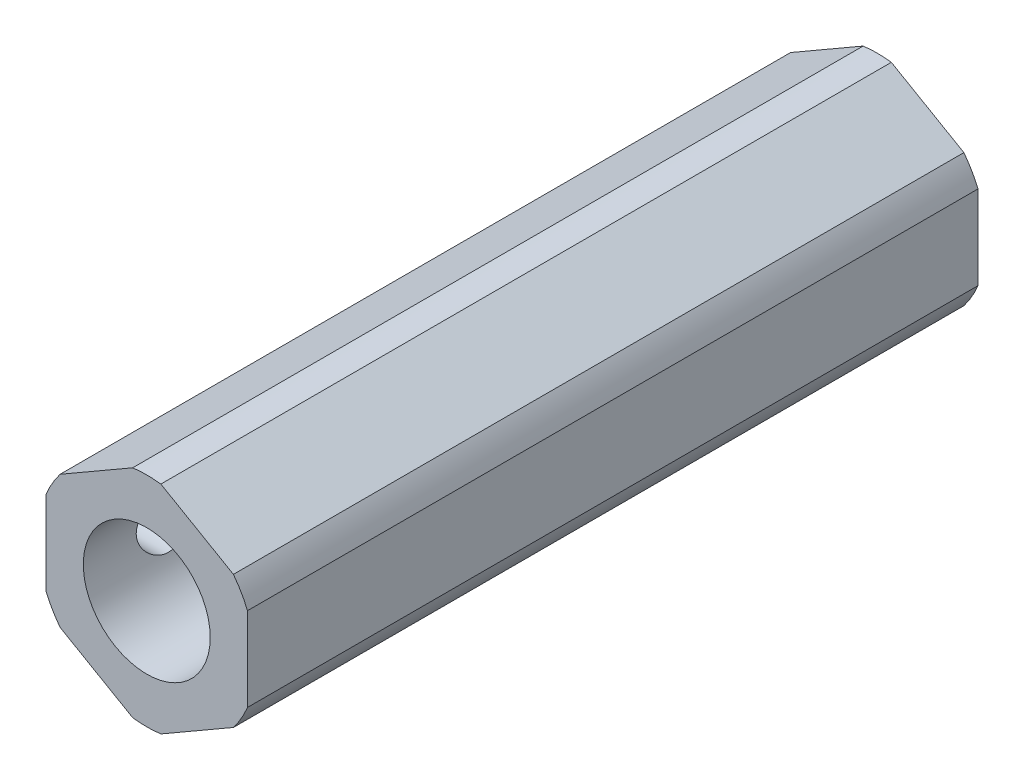
ISO-10303-21;
HEADER;
FILE_DESCRIPTION(('STEP AP214'),'2;1');
FILE_NAME('part.step','',(''),(''),'','','');
FILE_SCHEMA(('AUTOMOTIVE_DESIGN { 1 0 10303 214 1 1 1 1 }'));
ENDSEC;
DATA;
#1=APPLICATION_CONTEXT('core data for automotive mechanical design processes');
#2=APPLICATION_PROTOCOL_DEFINITION('international standard','automotive_design',2000,#1);
#3=PRODUCT_CONTEXT('',#1,'mechanical');
#4=PRODUCT('Part','Part','',(#3));
#5=PRODUCT_RELATED_PRODUCT_CATEGORY('part','',(#4));
#6=PRODUCT_DEFINITION_FORMATION('','',#4);
#7=PRODUCT_DEFINITION_CONTEXT('part definition',#1,'design');
#8=PRODUCT_DEFINITION('design','',#6,#7);
#9=PRODUCT_DEFINITION_SHAPE('','',#8);
#10=(LENGTH_UNIT() NAMED_UNIT(*) SI_UNIT(.MILLI.,.METRE.));
#11=(NAMED_UNIT(*) PLANE_ANGLE_UNIT() SI_UNIT($,.RADIAN.));
#12=(NAMED_UNIT(*) SI_UNIT($,.STERADIAN.) SOLID_ANGLE_UNIT());
#13=UNCERTAINTY_MEASURE_WITH_UNIT(LENGTH_MEASURE(1.E-05),#10,'distance_accuracy_value','');
#14=(GEOMETRIC_REPRESENTATION_CONTEXT(3) GLOBAL_UNCERTAINTY_ASSIGNED_CONTEXT((#13)) GLOBAL_UNIT_ASSIGNED_CONTEXT((#10,
#11,#12)) REPRESENTATION_CONTEXT('',''));
#15=CARTESIAN_POINT('',(0.,0.,0.));
#16=DIRECTION('',(0.,0.,1.));
#17=DIRECTION('',(1.,0.,0.));
#18=AXIS2_PLACEMENT_3D('',#15,#16,#17);
#19=CARTESIAN_POINT('',(0.,0.,-23.01875));
#20=DIRECTION('',(0.,0.,1.));
#21=DIRECTION('',(1.,0.,0.));
#22=AXIS2_PLACEMENT_3D('',#19,#20,#21);
#23=CYLINDRICAL_SURFACE('',#22,2.11582);
#24=CARTESIAN_POINT('',(0.,0.,-23.01875));
#25=DIRECTION('',(0.,0.,1.));
#26=DIRECTION('',(1.,0.,0.));
#27=AXIS2_PLACEMENT_3D('',#24,#25,#26);
#28=CIRCLE('',#27,2.11582);
#29=CARTESIAN_POINT('',(2.11582,0.,-23.01875));
#30=VERTEX_POINT('',#29);
#31=EDGE_CURVE('E166',#30,#30,#28,.T.);
#32=ORIENTED_EDGE('',*,*,#31,.F.);
#33=EDGE_LOOP('',(#32));
#34=FACE_BOUND('',#33,.T.);
#35=CARTESIAN_POINT('',(0.,0.,3.01879));
#36=DIRECTION('',(0.,0.,1.));
#37=DIRECTION('',(1.,0.,0.));
#38=AXIS2_PLACEMENT_3D('',#35,#36,#37);
#39=CIRCLE('',#38,2.11582);
#40=CARTESIAN_POINT('',(2.11582,0.,3.01879));
#41=VERTEX_POINT('',#40);
#42=EDGE_CURVE('E45',#41,#41,#39,.F.);
#43=ORIENTED_EDGE('',*,*,#42,.F.);
#44=EDGE_LOOP('',(#43));
#45=FACE_BOUND('',#44,.T.);
#46=ADVANCED_FACE('F41',(#34,#45),#23,.F.);
#47=CARTESIAN_POINT('',(0.,0.,23.01875));
#48=DIRECTION('',(0.,0.,1.));
#49=DIRECTION('',(1.,0.,0.));
#50=AXIS2_PLACEMENT_3D('',#47,#48,#49);
#51=PLANE('',#50);
#52=CARTESIAN_POINT('',(0.,0.,23.01875));
#53=DIRECTION('',(0.,0.,1.));
#54=DIRECTION('',(1.,0.,0.));
#55=AXIS2_PLACEMENT_3D('',#52,#53,#54);
#56=CIRCLE('',#55,4.);
#57=CARTESIAN_POINT('',(4.,0.,23.01875));
#58=VERTEX_POINT('',#57);
#59=EDGE_CURVE('E261',#58,#58,#56,.T.);
#60=ORIENTED_EDGE('',*,*,#59,.F.);
#61=EDGE_LOOP('',(#60));
#62=FACE_BOUND('',#61,.T.);
#63=CARTESIAN_POINT('',(0.,0.,23.01875));
#64=DIRECTION('',(0.,0.,1.));
#65=DIRECTION('',(1.,0.,0.));
#66=AXIS2_PLACEMENT_3D('',#63,#64,#65);
#67=CIRCLE('',#66,6.87705);
#68=CARTESIAN_POINT('',(5.46158862213451,-4.17909875751589,23.01875));
#69=VERTEX_POINT('',#68);
#70=CARTESIAN_POINT('',(6.35,-2.64032511303059,23.01875));
#71=VERTEX_POINT('',#70);
#72=EDGE_CURVE('E143',#69,#71,#67,.T.);
#73=ORIENTED_EDGE('',*,*,#72,.T.);
#74=DIRECTION('',(0.,1.,0.));
#75=VECTOR('',#74,1.);
#76=CARTESIAN_POINT('',(6.35,-2.64032511303059,23.01875));
#77=LINE('',#76,#75);
#78=CARTESIAN_POINT('',(6.35,2.64032511303059,23.01875));
#79=VERTEX_POINT('',#78);
#80=EDGE_CURVE('E137',#71,#79,#77,.T.);
#81=ORIENTED_EDGE('',*,*,#80,.T.);
#82=CARTESIAN_POINT('',(0.,0.,23.01875));
#83=DIRECTION('',(0.,0.,1.));
#84=DIRECTION('',(1.,0.,0.));
#85=AXIS2_PLACEMENT_3D('',#82,#83,#84);
#86=CIRCLE('',#85,6.87705);
#87=CARTESIAN_POINT('',(5.46158862213451,4.17909875751589,23.01875));
#88=VERTEX_POINT('',#87);
#89=EDGE_CURVE('E140',#79,#88,#86,.T.);
#90=ORIENTED_EDGE('',*,*,#89,.T.);
#91=DIRECTION('',(-0.866025403784439,0.499999999999999,0.));
#92=VECTOR('',#91,1.);
#93=CARTESIAN_POINT('',(5.46158862213451,4.17909875751589,23.01875));
#94=LINE('',#93,#92);
#95=CARTESIAN_POINT('',(0.888411377865485,6.81942387054648,23.01875));
#96=VERTEX_POINT('',#95);
#97=EDGE_CURVE('E59',#88,#96,#94,.T.);
#98=ORIENTED_EDGE('',*,*,#97,.T.);
#99=CARTESIAN_POINT('',(0.,0.,23.01875));
#100=DIRECTION('',(0.,0.,1.));
#101=DIRECTION('',(1.,0.,0.));
#102=AXIS2_PLACEMENT_3D('',#99,#100,#101);
#103=CIRCLE('',#102,6.87705);
#104=CARTESIAN_POINT('',(-0.88841137786549,6.81942387054648,23.01875));
#105=VERTEX_POINT('',#104);
#106=EDGE_CURVE('E190',#96,#105,#103,.T.);
#107=ORIENTED_EDGE('',*,*,#106,.T.);
#108=DIRECTION('',(-0.866025403784439,-0.5,0.));
#109=VECTOR('',#108,1.);
#110=CARTESIAN_POINT('',(-0.88841137786549,6.81942387054648,23.01875));
#111=LINE('',#110,#109);
#112=CARTESIAN_POINT('',(-5.46158862213451,4.17909875751589,23.01875));
#113=VERTEX_POINT('',#112);
#114=EDGE_CURVE('E112',#105,#113,#111,.T.);
#115=ORIENTED_EDGE('',*,*,#114,.T.);
#116=CARTESIAN_POINT('',(0.,0.,23.01875));
#117=DIRECTION('',(0.,0.,1.));
#118=DIRECTION('',(1.,0.,0.));
#119=AXIS2_PLACEMENT_3D('',#116,#117,#118);
#120=CIRCLE('',#119,6.87705);
#121=CARTESIAN_POINT('',(-6.35,2.64032511303059,23.01875));
#122=VERTEX_POINT('',#121);
#123=EDGE_CURVE('E218',#113,#122,#120,.T.);
#124=ORIENTED_EDGE('',*,*,#123,.T.);
#125=DIRECTION('',(0.,-1.,0.));
#126=VECTOR('',#125,1.);
#127=CARTESIAN_POINT('',(-6.35,2.64032511303059,23.01875));
#128=LINE('',#127,#126);
#129=CARTESIAN_POINT('',(-6.35,-2.64032511303059,23.01875));
#130=VERTEX_POINT('',#129);
#131=EDGE_CURVE('E232',#122,#130,#128,.T.);
#132=ORIENTED_EDGE('',*,*,#131,.T.);
#133=CARTESIAN_POINT('',(0.,0.,23.01875));
#134=DIRECTION('',(0.,0.,1.));
#135=DIRECTION('',(1.,0.,0.));
#136=AXIS2_PLACEMENT_3D('',#133,#134,#135);
#137=CIRCLE('',#136,6.87705);
#138=CARTESIAN_POINT('',(-5.46158862213451,-4.17909875751589,23.01875));
#139=VERTEX_POINT('',#138);
#140=EDGE_CURVE('E229',#130,#139,#137,.T.);
#141=ORIENTED_EDGE('',*,*,#140,.T.);
#142=DIRECTION('',(0.866025403784438,-0.5,0.));
#143=VECTOR('',#142,1.);
#144=CARTESIAN_POINT('',(-5.46158862213451,-4.17909875751589,23.01875));
#145=LINE('',#144,#143);
#146=CARTESIAN_POINT('',(-0.888411377865495,-6.81942387054648,23.01875));
#147=VERTEX_POINT('',#146);
#148=EDGE_CURVE('E231',#139,#147,#145,.T.);
#149=ORIENTED_EDGE('',*,*,#148,.T.);
#150=CARTESIAN_POINT('',(0.,0.,23.01875));
#151=DIRECTION('',(0.,0.,1.));
#152=DIRECTION('',(1.,0.,0.));
#153=AXIS2_PLACEMENT_3D('',#150,#151,#152);
#154=CIRCLE('',#153,6.87705);
#155=CARTESIAN_POINT('',(0.888411377865487,-6.81942387054648,23.01875));
#156=VERTEX_POINT('',#155);
#157=EDGE_CURVE('E234',#147,#156,#154,.T.);
#158=ORIENTED_EDGE('',*,*,#157,.T.);
#159=DIRECTION('',(0.866025403784439,0.5,0.));
#160=VECTOR('',#159,1.);
#161=CARTESIAN_POINT('',(0.88841137786549,-6.81942387054648,23.01875));
#162=LINE('',#161,#160);
#163=EDGE_CURVE('E240',#156,#69,#162,.T.);
#164=ORIENTED_EDGE('',*,*,#163,.T.);
#165=EDGE_LOOP('',(#73,#81,#90,#98,#107,#115,#124,#132,#141,#149,#158,#164));
#166=FACE_BOUND('',#165,.T.);
#167=ADVANCED_FACE('F43',(#62,#166),#51,.T.);
#168=CARTESIAN_POINT('',(-0.88841137786549,6.81942387054648,23.01875));
#169=DIRECTION('',(0.5,-0.866025403784439,0.));
#170=DIRECTION('',(0.866025403784439,0.5,0.));
#171=AXIS2_PLACEMENT_3D('',#168,#169,#170);
#172=PLANE('',#171);
#173=DIRECTION('',(0.,0.,-1.));
#174=VECTOR('',#173,1.);
#175=CARTESIAN_POINT('',(-5.46158862213451,4.17909875751589,23.01875));
#176=LINE('',#175,#174);
#177=CARTESIAN_POINT('',(-5.46158862213451,4.17909875751589,-23.01875));
#178=VERTEX_POINT('',#177);
#179=EDGE_CURVE('E51',#113,#178,#176,.T.);
#180=ORIENTED_EDGE('',*,*,#179,.F.);
#181=ORIENTED_EDGE('',*,*,#114,.F.);
#182=DIRECTION('',(0.,0.,-1.));
#183=VECTOR('',#182,1.);
#184=CARTESIAN_POINT('',(-0.88841137786549,6.81942387054648,23.01875));
#185=LINE('',#184,#183);
#186=CARTESIAN_POINT('',(-0.88841137786549,6.81942387054648,-23.01875));
#187=VERTEX_POINT('',#186);
#188=EDGE_CURVE('E11',#105,#187,#185,.T.);
#189=ORIENTED_EDGE('',*,*,#188,.T.);
#190=DIRECTION('',(-0.866025403784439,-0.5,0.));
#191=VECTOR('',#190,1.);
#192=CARTESIAN_POINT('',(-0.88841137786549,6.81942387054648,-23.01875));
#193=LINE('',#192,#191);
#194=EDGE_CURVE('E165',#187,#178,#193,.T.);
#195=ORIENTED_EDGE('',*,*,#194,.T.);
#196=EDGE_LOOP('',(#180,#181,#189,#195));
#197=FACE_BOUND('',#196,.T.);
#198=ADVANCED_FACE('F317',(#197),#172,.F.);
#199=CARTESIAN_POINT('',(-6.35,2.64032511303059,23.01875));
#200=DIRECTION('',(1.,0.,0.));
#201=DIRECTION('',(0.,0.,-1.));
#202=AXIS2_PLACEMENT_3D('',#199,#200,#201);
#203=PLANE('',#202);
#204=CARTESIAN_POINT('',(-6.35,0.,10.01649));
#205=DIRECTION('',(-1.,0.,0.));
#206=DIRECTION('',(0.,0.,1.));
#207=AXIS2_PLACEMENT_3D('',#204,#205,#206);
#208=CIRCLE('',#207,1.66624);
#209=CARTESIAN_POINT('',(-6.35,0.,11.68273));
#210=VERTEX_POINT('',#209);
#211=EDGE_CURVE('E265',#210,#210,#208,.T.);
#212=ORIENTED_EDGE('',*,*,#211,.F.);
#213=EDGE_LOOP('',(#212));
#214=FACE_BOUND('',#213,.T.);
#215=CARTESIAN_POINT('',(-6.35,0.,18.01749));
#216=DIRECTION('',(-1.,0.,0.));
#217=DIRECTION('',(0.,0.,1.));
#218=AXIS2_PLACEMENT_3D('',#215,#216,#217);
#219=CIRCLE('',#218,1.66624);
#220=CARTESIAN_POINT('',(-6.35,0.,19.68373));
#221=VERTEX_POINT('',#220);
#222=EDGE_CURVE('E277',#221,#221,#219,.T.);
#223=ORIENTED_EDGE('',*,*,#222,.F.);
#224=EDGE_LOOP('',(#223));
#225=FACE_BOUND('',#224,.T.);
#226=DIRECTION('',(0.,0.,-1.));
#227=VECTOR('',#226,1.);
#228=CARTESIAN_POINT('',(-6.35,-2.64032511303059,23.01875));
#229=LINE('',#228,#227);
#230=CARTESIAN_POINT('',(-6.35,-2.64032511303059,-23.01875));
#231=VERTEX_POINT('',#230);
#232=EDGE_CURVE('E206',#130,#231,#229,.T.);
#233=ORIENTED_EDGE('',*,*,#232,.F.);
#234=ORIENTED_EDGE('',*,*,#131,.F.);
#235=DIRECTION('',(0.,0.,-1.));
#236=VECTOR('',#235,1.);
#237=CARTESIAN_POINT('',(-6.35,2.64032511303059,23.01875));
#238=LINE('',#237,#236);
#239=CARTESIAN_POINT('',(-6.35,2.64032511303059,-23.01875));
#240=VERTEX_POINT('',#239);
#241=EDGE_CURVE('E209',#122,#240,#238,.T.);
#242=ORIENTED_EDGE('',*,*,#241,.T.);
#243=DIRECTION('',(0.,-1.,0.));
#244=VECTOR('',#243,1.);
#245=CARTESIAN_POINT('',(-6.35,2.64032511303059,-23.01875));
#246=LINE('',#245,#244);
#247=EDGE_CURVE('E171',#240,#231,#246,.T.);
#248=ORIENTED_EDGE('',*,*,#247,.T.);
#249=EDGE_LOOP('',(#233,#234,#242,#248));
#250=FACE_BOUND('',#249,.T.);
#251=ADVANCED_FACE('F223',(#214,#225,#250),#203,.F.);
#252=CARTESIAN_POINT('',(-5.46158862213451,-4.17909875751589,23.01875));
#253=DIRECTION('',(0.5,0.866025403784439,0.));
#254=DIRECTION('',(-0.866025403784439,0.5,0.));
#255=AXIS2_PLACEMENT_3D('',#252,#253,#254);
#256=PLANE('',#255);
#257=DIRECTION('',(0.,0.,-1.));
#258=VECTOR('',#257,1.);
#259=CARTESIAN_POINT('',(-0.888411377865495,-6.81942387054648,23.01875));
#260=LINE('',#259,#258);
#261=CARTESIAN_POINT('',(-0.888411377865495,-6.81942387054648,-23.01875));
#262=VERTEX_POINT('',#261);
#263=EDGE_CURVE('E200',#147,#262,#260,.T.);
#264=ORIENTED_EDGE('',*,*,#263,.F.);
#265=ORIENTED_EDGE('',*,*,#148,.F.);
#266=DIRECTION('',(0.,0.,-1.));
#267=VECTOR('',#266,1.);
#268=CARTESIAN_POINT('',(-5.46158862213451,-4.17909875751589,23.01875));
#269=LINE('',#268,#267);
#270=CARTESIAN_POINT('',(-5.46158862213451,-4.17909875751589,-23.01875));
#271=VERTEX_POINT('',#270);
#272=EDGE_CURVE('E203',#139,#271,#269,.T.);
#273=ORIENTED_EDGE('',*,*,#272,.T.);
#274=DIRECTION('',(0.866025403784438,-0.5,0.));
#275=VECTOR('',#274,1.);
#276=CARTESIAN_POINT('',(-5.46158862213451,-4.17909875751589,-23.01875));
#277=LINE('',#276,#275);
#278=EDGE_CURVE('E176',#271,#262,#277,.T.);
#279=ORIENTED_EDGE('',*,*,#278,.T.);
#280=EDGE_LOOP('',(#264,#265,#273,#279));
#281=FACE_BOUND('',#280,.T.);
#282=ADVANCED_FACE('F306',(#281),#256,.F.);
#283=CARTESIAN_POINT('',(0.88841137786549,-6.81942387054648,23.01875));
#284=DIRECTION('',(-0.5,0.866025403784439,0.));
#285=DIRECTION('',(-0.866025403784439,-0.5,0.));
#286=AXIS2_PLACEMENT_3D('',#283,#284,#285);
#287=PLANE('',#286);
#288=DIRECTION('',(0.,0.,-1.));
#289=VECTOR('',#288,1.);
#290=CARTESIAN_POINT('',(5.46158862213451,-4.17909875751589,23.01875));
#291=LINE('',#290,#289);
#292=CARTESIAN_POINT('',(5.46158862213451,-4.17909875751589,-23.01875));
#293=VERTEX_POINT('',#292);
#294=EDGE_CURVE('E194',#69,#293,#291,.T.);
#295=ORIENTED_EDGE('',*,*,#294,.F.);
#296=ORIENTED_EDGE('',*,*,#163,.F.);
#297=DIRECTION('',(0.,0.,-1.));
#298=VECTOR('',#297,1.);
#299=CARTESIAN_POINT('',(0.888411377865487,-6.81942387054648,23.01875));
#300=LINE('',#299,#298);
#301=CARTESIAN_POINT('',(0.888411377865487,-6.81942387054648,-23.01875));
#302=VERTEX_POINT('',#301);
#303=EDGE_CURVE('E197',#156,#302,#300,.T.);
#304=ORIENTED_EDGE('',*,*,#303,.T.);
#305=DIRECTION('',(0.866025403784439,0.5,0.));
#306=VECTOR('',#305,1.);
#307=CARTESIAN_POINT('',(0.88841137786549,-6.81942387054648,-23.01875));
#308=LINE('',#307,#306);
#309=EDGE_CURVE('E181',#302,#293,#308,.T.);
#310=ORIENTED_EDGE('',*,*,#309,.T.);
#311=EDGE_LOOP('',(#295,#296,#304,#310));
#312=FACE_BOUND('',#311,.T.);
#313=ADVANCED_FACE('F246',(#312),#287,.F.);
#314=CARTESIAN_POINT('',(6.35,-2.64032511303059,23.01875));
#315=DIRECTION('',(-1.,0.,0.));
#316=DIRECTION('',(0.,0.,1.));
#317=AXIS2_PLACEMENT_3D('',#314,#315,#316);
#318=PLANE('',#317);
#319=ORIENTED_EDGE('',*,*,#80,.F.);
#320=DIRECTION('',(0.,0.,-1.));
#321=VECTOR('',#320,1.);
#322=CARTESIAN_POINT('',(6.35,-2.64032511303059,23.01875));
#323=LINE('',#322,#321);
#324=CARTESIAN_POINT('',(6.35,-2.64032511303059,-23.01875));
#325=VERTEX_POINT('',#324);
#326=EDGE_CURVE('E153',#71,#325,#323,.T.);
#327=ORIENTED_EDGE('',*,*,#326,.T.);
#328=DIRECTION('',(0.,1.,0.));
#329=VECTOR('',#328,1.);
#330=CARTESIAN_POINT('',(6.35,-2.64032511303059,-23.01875));
#331=LINE('',#330,#329);
#332=CARTESIAN_POINT('',(6.35,2.64032511303059,-23.01875));
#333=VERTEX_POINT('',#332);
#334=EDGE_CURVE('E151',#325,#333,#331,.T.);
#335=ORIENTED_EDGE('',*,*,#334,.T.);
#336=DIRECTION('',(0.,0.,-1.));
#337=VECTOR('',#336,1.);
#338=CARTESIAN_POINT('',(6.35,2.64032511303059,23.01875));
#339=LINE('',#338,#337);
#340=EDGE_CURVE('E149',#79,#333,#339,.T.);
#341=ORIENTED_EDGE('',*,*,#340,.F.);
#342=EDGE_LOOP('',(#319,#327,#335,#341));
#343=FACE_BOUND('',#342,.T.);
#344=ADVANCED_FACE('F150',(#343),#318,.F.);
#345=CARTESIAN_POINT('',(5.46158862213451,4.17909875751589,23.01875));
#346=DIRECTION('',(-0.499999999999999,-0.866025403784439,0.));
#347=DIRECTION('',(0.866025403784439,-0.499999999999999,0.));
#348=AXIS2_PLACEMENT_3D('',#345,#346,#347);
#349=PLANE('',#348);
#350=DIRECTION('',(0.,0.,-1.));
#351=VECTOR('',#350,1.);
#352=CARTESIAN_POINT('',(0.888411377865485,6.81942387054648,23.01875));
#353=LINE('',#352,#351);
#354=CARTESIAN_POINT('',(0.888411377865485,6.81942387054648,-23.01875));
#355=VERTEX_POINT('',#354);
#356=EDGE_CURVE('E158',#96,#355,#353,.T.);
#357=ORIENTED_EDGE('',*,*,#356,.F.);
#358=ORIENTED_EDGE('',*,*,#97,.F.);
#359=DIRECTION('',(0.,0.,-1.));
#360=VECTOR('',#359,1.);
#361=CARTESIAN_POINT('',(5.46158862213451,4.17909875751589,23.01875));
#362=LINE('',#361,#360);
#363=CARTESIAN_POINT('',(5.46158862213451,4.17909875751589,-23.01875));
#364=VERTEX_POINT('',#363);
#365=EDGE_CURVE('E154',#88,#364,#362,.T.);
#366=ORIENTED_EDGE('',*,*,#365,.T.);
#367=DIRECTION('',(-0.866025403784439,0.499999999999999,0.));
#368=VECTOR('',#367,1.);
#369=CARTESIAN_POINT('',(5.46158862213451,4.17909875751589,-23.01875));
#370=LINE('',#369,#368);
#371=EDGE_CURVE('E100',#364,#355,#370,.T.);
#372=ORIENTED_EDGE('',*,*,#371,.T.);
#373=EDGE_LOOP('',(#357,#358,#366,#372));
#374=FACE_BOUND('',#373,.T.);
#375=ADVANCED_FACE('F251',(#374),#349,.F.);
#376=CARTESIAN_POINT('',(0.,0.,23.01875));
#377=DIRECTION('',(0.,0.,-1.));
#378=DIRECTION('',(-1.,0.,0.));
#379=AXIS2_PLACEMENT_3D('',#376,#377,#378);
#380=CYLINDRICAL_SURFACE('',#379,6.87705);
#381=CARTESIAN_POINT('',(0.,0.,-23.01875));
#382=DIRECTION('',(0.,0.,1.));
#383=DIRECTION('',(1.,0.,0.));
#384=AXIS2_PLACEMENT_3D('',#381,#382,#383);
#385=CIRCLE('',#384,6.87705);
#386=EDGE_CURVE('E162',#355,#187,#385,.T.);
#387=ORIENTED_EDGE('',*,*,#386,.T.);
#388=ORIENTED_EDGE('',*,*,#188,.F.);
#389=ORIENTED_EDGE('',*,*,#106,.F.);
#390=ORIENTED_EDGE('',*,*,#356,.T.);
#391=EDGE_LOOP('',(#387,#388,#389,#390));
#392=FACE_BOUND('',#391,.T.);
#393=ADVANCED_FACE('F255',(#392),#380,.T.);
#394=CARTESIAN_POINT('',(0.,0.,23.01875));
#395=DIRECTION('',(0.,0.,-1.));
#396=DIRECTION('',(-1.,0.,0.));
#397=AXIS2_PLACEMENT_3D('',#394,#395,#396);
#398=CYLINDRICAL_SURFACE('',#397,6.87705);
#399=CARTESIAN_POINT('',(0.,0.,-23.01875));
#400=DIRECTION('',(0.,0.,1.));
#401=DIRECTION('',(1.,0.,0.));
#402=AXIS2_PLACEMENT_3D('',#399,#400,#401);
#403=CIRCLE('',#402,6.87705);
#404=EDGE_CURVE('E168',#178,#240,#403,.T.);
#405=ORIENTED_EDGE('',*,*,#404,.T.);
#406=ORIENTED_EDGE('',*,*,#241,.F.);
#407=ORIENTED_EDGE('',*,*,#123,.F.);
#408=ORIENTED_EDGE('',*,*,#179,.T.);
#409=EDGE_LOOP('',(#405,#406,#407,#408));
#410=FACE_BOUND('',#409,.T.);
#411=ADVANCED_FACE('F216',(#410),#398,.T.);
#412=CARTESIAN_POINT('',(0.,0.,23.01875));
#413=DIRECTION('',(0.,0.,-1.));
#414=DIRECTION('',(-1.,0.,0.));
#415=AXIS2_PLACEMENT_3D('',#412,#413,#414);
#416=CYLINDRICAL_SURFACE('',#415,6.87705);
#417=CARTESIAN_POINT('',(0.,0.,-23.01875));
#418=DIRECTION('',(0.,0.,1.));
#419=DIRECTION('',(1.,0.,0.));
#420=AXIS2_PLACEMENT_3D('',#417,#418,#419);
#421=CIRCLE('',#420,6.87705);
#422=EDGE_CURVE('E173',#231,#271,#421,.T.);
#423=ORIENTED_EDGE('',*,*,#422,.T.);
#424=ORIENTED_EDGE('',*,*,#272,.F.);
#425=ORIENTED_EDGE('',*,*,#140,.F.);
#426=ORIENTED_EDGE('',*,*,#232,.T.);
#427=EDGE_LOOP('',(#423,#424,#425,#426));
#428=FACE_BOUND('',#427,.T.);
#429=ADVANCED_FACE('F227',(#428),#416,.T.);
#430=CARTESIAN_POINT('',(0.,0.,23.01875));
#431=DIRECTION('',(0.,0.,-1.));
#432=DIRECTION('',(-1.,0.,0.));
#433=AXIS2_PLACEMENT_3D('',#430,#431,#432);
#434=CYLINDRICAL_SURFACE('',#433,6.87705);
#435=CARTESIAN_POINT('',(0.,0.,-23.01875));
#436=DIRECTION('',(0.,0.,1.));
#437=DIRECTION('',(1.,0.,0.));
#438=AXIS2_PLACEMENT_3D('',#435,#436,#437);
#439=CIRCLE('',#438,6.87705);
#440=EDGE_CURVE('E178',#262,#302,#439,.T.);
#441=ORIENTED_EDGE('',*,*,#440,.T.);
#442=ORIENTED_EDGE('',*,*,#303,.F.);
#443=ORIENTED_EDGE('',*,*,#157,.F.);
#444=ORIENTED_EDGE('',*,*,#263,.T.);
#445=EDGE_LOOP('',(#441,#442,#443,#444));
#446=FACE_BOUND('',#445,.T.);
#447=ADVANCED_FACE('F303',(#446),#434,.T.);
#448=CARTESIAN_POINT('',(0.,0.,23.01875));
#449=DIRECTION('',(0.,0.,-1.));
#450=DIRECTION('',(-1.,0.,0.));
#451=AXIS2_PLACEMENT_3D('',#448,#449,#450);
#452=CYLINDRICAL_SURFACE('',#451,6.87705);
#453=CARTESIAN_POINT('',(0.,0.,-23.01875));
#454=DIRECTION('',(0.,0.,1.));
#455=DIRECTION('',(1.,0.,0.));
#456=AXIS2_PLACEMENT_3D('',#453,#454,#455);
#457=CIRCLE('',#456,6.87705);
#458=EDGE_CURVE('E183',#293,#325,#457,.T.);
#459=ORIENTED_EDGE('',*,*,#458,.T.);
#460=ORIENTED_EDGE('',*,*,#326,.F.);
#461=ORIENTED_EDGE('',*,*,#72,.F.);
#462=ORIENTED_EDGE('',*,*,#294,.T.);
#463=EDGE_LOOP('',(#459,#460,#461,#462));
#464=FACE_BOUND('',#463,.T.);
#465=ADVANCED_FACE('F249',(#464),#452,.T.);
#466=CARTESIAN_POINT('',(0.,0.,23.01875));
#467=DIRECTION('',(0.,0.,-1.));
#468=DIRECTION('',(-1.,0.,0.));
#469=AXIS2_PLACEMENT_3D('',#466,#467,#468);
#470=CYLINDRICAL_SURFACE('',#469,6.87705);
#471=CARTESIAN_POINT('',(0.,0.,-23.01875));
#472=DIRECTION('',(0.,0.,1.));
#473=DIRECTION('',(1.,0.,0.));
#474=AXIS2_PLACEMENT_3D('',#471,#472,#473);
#475=CIRCLE('',#474,6.87705);
#476=EDGE_CURVE('E187',#333,#364,#475,.T.);
#477=ORIENTED_EDGE('',*,*,#476,.T.);
#478=ORIENTED_EDGE('',*,*,#365,.F.);
#479=ORIENTED_EDGE('',*,*,#89,.F.);
#480=ORIENTED_EDGE('',*,*,#340,.T.);
#481=EDGE_LOOP('',(#477,#478,#479,#480));
#482=FACE_BOUND('',#481,.T.);
#483=ADVANCED_FACE('F156',(#482),#470,.T.);
#484=CARTESIAN_POINT('',(0.,0.,-23.01875));
#485=DIRECTION('',(0.,0.,1.));
#486=DIRECTION('',(1.,0.,0.));
#487=AXIS2_PLACEMENT_3D('',#484,#485,#486);
#488=PLANE('',#487);
#489=ORIENTED_EDGE('',*,*,#31,.T.);
#490=EDGE_LOOP('',(#489));
#491=FACE_BOUND('',#490,.T.);
#492=ORIENTED_EDGE('',*,*,#371,.F.);
#493=ORIENTED_EDGE('',*,*,#476,.F.);
#494=ORIENTED_EDGE('',*,*,#334,.F.);
#495=ORIENTED_EDGE('',*,*,#458,.F.);
#496=ORIENTED_EDGE('',*,*,#309,.F.);
#497=ORIENTED_EDGE('',*,*,#440,.F.);
#498=ORIENTED_EDGE('',*,*,#278,.F.);
#499=ORIENTED_EDGE('',*,*,#422,.F.);
#500=ORIENTED_EDGE('',*,*,#247,.F.);
#501=ORIENTED_EDGE('',*,*,#404,.F.);
#502=ORIENTED_EDGE('',*,*,#194,.F.);
#503=ORIENTED_EDGE('',*,*,#386,.F.);
#504=EDGE_LOOP('',(#492,#493,#494,#495,#496,#497,#498,#499,#500,#501,#502,#503));
#505=FACE_BOUND('',#504,.T.);
#506=ADVANCED_FACE('F219',(#491,#505),#488,.F.);
#507=CARTESIAN_POINT('',(0.,0.,3.01879));
#508=DIRECTION('',(0.,0.,1.));
#509=DIRECTION('',(1.,0.,0.));
#510=AXIS2_PLACEMENT_3D('',#507,#508,#509);
#511=PLANE('',#510);
#512=CARTESIAN_POINT('',(0.,0.,3.01879));
#513=DIRECTION('',(0.,0.,1.));
#514=DIRECTION('',(1.,0.,0.));
#515=AXIS2_PLACEMENT_3D('',#512,#513,#514);
#516=CIRCLE('',#515,4.);
#517=CARTESIAN_POINT('',(4.,0.,3.01879));
#518=VERTEX_POINT('',#517);
#519=EDGE_CURVE('E264',#518,#518,#516,.T.);
#520=ORIENTED_EDGE('',*,*,#519,.T.);
#521=EDGE_LOOP('',(#520));
#522=FACE_BOUND('',#521,.T.);
#523=ORIENTED_EDGE('',*,*,#42,.T.);
#524=EDGE_LOOP('',(#523));
#525=FACE_BOUND('',#524,.T.);
#526=ADVANCED_FACE('F284',(#522,#525),#511,.T.);
#527=CARTESIAN_POINT('',(0.,0.,3.01879));
#528=DIRECTION('',(0.,0.,1.));
#529=DIRECTION('',(1.,0.,0.));
#530=AXIS2_PLACEMENT_3D('',#527,#528,#529);
#531=CYLINDRICAL_SURFACE('',#530,4.);
#532=CARTESIAN_POINT('',(-4.,0.,11.68273));
#533=CARTESIAN_POINT('',(-3.99999278615686,-0.0892564950838411,11.6827204028025));
#534=CARTESIAN_POINT('',(-3.99697785252806,-0.178653445874408,11.6755155852757));
#535=CARTESIAN_POINT('',(-3.98520895826679,-0.354913741163095,11.646952092414));
#536=CARTESIAN_POINT('',(-3.97644001809522,-0.441769852844397,11.6255564722601));
#537=CARTESIAN_POINT('',(-3.95410531852721,-0.610109779316258,11.5695386912356));
#538=CARTESIAN_POINT('',(-3.94055581629255,-0.691610704733507,11.5349613255739));
#539=CARTESIAN_POINT('',(-3.90997942026184,-0.847576254002893,11.4537464109452));
#540=CARTESIAN_POINT('',(-3.89295358110795,-0.922043001867831,11.4071125185168));
#541=CARTESIAN_POINT('',(-3.85617282951429,-1.06568209919382,11.3006362361953));
#542=CARTESIAN_POINT('',(-3.83632857309114,-1.13445507097262,11.2402862097413));
#543=CARTESIAN_POINT('',(-3.79653535169262,-1.26124697953997,11.1091640882311));
#544=CARTESIAN_POINT('',(-3.77658633725556,-1.31926025676097,11.0383865432523));
#545=CARTESIAN_POINT('',(-3.73774506509654,-1.42570450011951,10.8841995530044));
#546=CARTESIAN_POINT('',(-3.71895300286823,-1.47352402441445,10.800340107288));
#547=CARTESIAN_POINT('',(-3.68597008124344,-1.55420022100683,10.6248715027468));
#548=CARTESIAN_POINT('',(-3.671776853786,-1.58706459764031,10.5332663631247));
#549=CARTESIAN_POINT('',(-3.6505655523416,-1.63524863717173,10.3495033770323));
#550=CARTESIAN_POINT('',(-3.64323489229324,-1.65133690512306,10.2575845362413));
#551=CARTESIAN_POINT('',(-3.63567986362934,-1.66790999232106,10.0720821602339));
#552=CARTESIAN_POINT('',(-3.63545157880415,-1.66840341048233,9.97849957088439));
#553=CARTESIAN_POINT('',(-3.6418625319979,-1.65435174165026,9.79998011431818));
#554=CARTESIAN_POINT('',(-3.64797697270696,-1.640955894118,9.71493015667124));
#555=CARTESIAN_POINT('',(-3.66549761588335,-1.60143357359013,9.54841779407019));
#556=CARTESIAN_POINT('',(-3.67690483115058,-1.57530466400881,9.46695607901306));
#557=CARTESIAN_POINT('',(-3.70398329076342,-1.51054865952292,9.30787621453368));
#558=CARTESIAN_POINT('',(-3.71974008581751,-1.47166750232053,9.23037670222263));
#559=CARTESIAN_POINT('',(-3.75372239167387,-1.38269032288986,9.08270087003671));
#560=CARTESIAN_POINT('',(-3.77194887463804,-1.33258987923482,9.0125274533443));
#561=CARTESIAN_POINT('',(-3.81068981593156,-1.21762843949499,8.87525751895511));
#562=CARTESIAN_POINT('',(-3.83126749499628,-1.15187813276033,8.80892151805152));
#563=CARTESIAN_POINT('',(-3.8710932221594,-1.00998203418172,8.68796235411565));
#564=CARTESIAN_POINT('',(-3.89034095839519,-0.9338338164729,8.63334193203169));
#565=CARTESIAN_POINT('',(-3.92589646388082,-0.770993354834365,8.53624992582201));
#566=CARTESIAN_POINT('',(-3.94212620606392,-0.684098465523778,8.4940875244231));
#567=CARTESIAN_POINT('',(-3.96921825305863,-0.503600517363095,8.42524604569426));
#568=CARTESIAN_POINT('',(-3.9800835221702,-0.410001196065356,8.39855841589126));
#569=CARTESIAN_POINT('',(-3.99466874321172,-0.225106983862132,8.36301546259938));
#570=CARTESIAN_POINT('',(-3.99879697140909,-0.134040460858859,8.35313950690697));
#571=CARTESIAN_POINT('',(-4.00074606368991,0.0485347036548917,8.3484576391928));
#572=CARTESIAN_POINT('',(-3.99856873744886,0.140043210791823,8.35364740335498));
#573=CARTESIAN_POINT('',(-3.98841618421731,0.316126306841151,8.37821884097058));
#574=CARTESIAN_POINT('',(-3.98073386309435,0.400819702001764,8.39688389307467));
#575=CARTESIAN_POINT('',(-3.96065667675385,0.565780678490783,8.44687885881006));
#576=CARTESIAN_POINT('',(-3.94826121610917,0.646047699152414,8.47821037267068));
#577=CARTESIAN_POINT('',(-3.91946786054283,0.802691549338795,8.55367236751372));
#578=CARTESIAN_POINT('',(-3.90295760265426,0.878870098792284,8.59817017680343));
#579=CARTESIAN_POINT('',(-3.86769708757404,1.02295157864902,8.69829794432399));
#580=CARTESIAN_POINT('',(-3.84894589669467,1.09085103558651,8.7539325492779));
#581=CARTESIAN_POINT('',(-3.80956887713304,1.22154465917045,8.87940416857875));
#582=CARTESIAN_POINT('',(-3.78890481691924,1.28362770277841,8.94997180492768));
#583=CARTESIAN_POINT('',(-3.74923247333857,1.39526874940991,9.10085362254029));
#584=CARTESIAN_POINT('',(-3.73022456591773,1.44482391343902,9.18117000691535));
#585=CARTESIAN_POINT('',(-3.69589386836082,1.5305358471205,9.35092396567675));
#586=CARTESIAN_POINT('',(-3.68062729029319,1.56649218978061,9.44047494794984));
#587=CARTESIAN_POINT('',(-3.65628375609074,1.62251020402727,9.62519604763062));
#588=CARTESIAN_POINT('',(-3.64720170060919,1.64258497272038,9.7203614652145));
#589=CARTESIAN_POINT('',(-3.63703400080563,1.6649687384726,9.90571983782381));
#590=CARTESIAN_POINT('',(-3.63538683997242,1.66852587675845,9.99573196419883));
#591=CARTESIAN_POINT('',(-3.63878372032672,1.66110513275311,10.1750170163484));
#592=CARTESIAN_POINT('',(-3.6438267355733,1.6501294790713,10.2642900533502));
#593=CARTESIAN_POINT('',(-3.65952264526222,1.61500295937027,10.4352854375588));
#594=CARTESIAN_POINT('',(-3.66990374316815,1.59148854964911,10.5171658571466));
#595=CARTESIAN_POINT('',(-3.69489312111697,1.53257405322683,10.6758381970623));
#596=CARTESIAN_POINT('',(-3.70950258867739,1.49717062710361,10.7526286804496));
#597=CARTESIAN_POINT('',(-3.74239151805826,1.41303218325127,10.9039794249868));
#598=CARTESIAN_POINT('',(-3.76083879746375,1.36362371730694,10.9781281591778));
#599=CARTESIAN_POINT('',(-3.79885581326801,1.25382110358067,11.1174728829945));
#600=CARTESIAN_POINT('',(-3.81842593693409,1.19342314975632,11.1826657571225));
#601=CARTESIAN_POINT('',(-3.85819446481438,1.05813689614619,11.3071295538898));
#602=CARTESIAN_POINT('',(-3.87833493399613,0.982513913267839,11.3656241566699));
#603=CARTESIAN_POINT('',(-3.91554273539295,0.821778431995705,11.4691324365446));
#604=CARTESIAN_POINT('',(-3.93260866567196,0.736661633084931,11.5141399699446));
#605=CARTESIAN_POINT('',(-3.96149750963462,0.560677876142257,11.5884223352319));
#606=CARTESIAN_POINT('',(-3.97340250049154,0.4699293596803,11.6179451536949));
#607=CARTESIAN_POINT('',(-3.99096249657124,0.28431898611976,11.6610374138548));
#608=CARTESIAN_POINT('',(-3.99663706864898,0.189470984620404,11.674656809435));
#609=CARTESIAN_POINT('',(-3.99963188353466,0.0628638204102663,11.6818439764965));
#610=CARTESIAN_POINT('',(-4.00000254107816,0.0314406240947053,11.6827333806154));
#611=CARTESIAN_POINT('',(-4.,0.,11.68273));
#612=B_SPLINE_CURVE_WITH_KNOTS('',3,(#532,#533,#534,#535,#536,#537,#538,#539,#540,#541,#542,
#543,#544,#545,#546,#547,#548,#549,#550,#551,#552,#553,#554,#555,#556,#557,#558,#559,#560,#561,
#562,#563,#564,#565,#566,#567,#568,#569,#570,#571,#572,#573,#574,#575,#576,#577,#578,#579,#580,
#581,#582,#583,#584,#585,#586,#587,#588,#589,#590,#591,#592,#593,#594,#595,#596,#597,#598,#599,
#600,#601,#602,#603,#604,#605,#606,#607,#608,#609,#610,#611),.UNSPECIFIED.,.T.,.F.,(4,2,2,2,2,2,
2,2,2,2,2,2,2,2,2,2,2,2,2,2,2,2,2,2,2,2,2,2,2,2,2,2,2,2,2,2,2,2,2,4),(0.,0.267680035063576,
0.53605970732993,0.803535366055602,1.07092999895303,1.35058652498936,1.63038973492234,
1.92395126311833,2.2173613876443,2.49664339440191,2.77577140390534,3.03351475440056,
3.29130744577816,3.55458445069367,3.81796539403565,4.10359255775945,4.3892864734055,
4.68156820581396,4.97368824794633,5.2473417122141,5.52091664653013,5.78092347326918,
6.04096315848467,6.30908012294111,6.57730919072872,6.86469808720153,7.15215205179525,
7.44369130849504,7.73498988926461,8.0038743566524,8.27271759527594,8.5290581685435,
8.78547080381735,9.05729658148383,9.329216681703,9.6209270958206,9.91277018997307,
10.1997845504484,10.485894930612,10.5801852940437),.UNSPECIFIED.);
#613=CARTESIAN_POINT('',(-4.,0.,11.68273));
#614=VERTEX_POINT('',#613);
#615=EDGE_CURVE('E276',#614,#614,#612,.T.);
#616=ORIENTED_EDGE('',*,*,#615,.F.);
#617=EDGE_LOOP('',(#616));
#618=FACE_BOUND('',#617,.T.);
#619=CARTESIAN_POINT('',(-4.,0.,19.68373));
#620=CARTESIAN_POINT('',(-3.99999278615686,-0.0892564950838406,19.6837204028025));
#621=CARTESIAN_POINT('',(-3.99697785252806,-0.178653445874407,19.6765155852757));
#622=CARTESIAN_POINT('',(-3.98520895826679,-0.354913741163094,19.647952092414));
#623=CARTESIAN_POINT('',(-3.97644001809522,-0.441769852844396,19.6265564722601));
#624=CARTESIAN_POINT('',(-3.95410531852721,-0.610109779316257,19.5705386912356));
#625=CARTESIAN_POINT('',(-3.94055581629255,-0.691610704733506,19.5359613255739));
#626=CARTESIAN_POINT('',(-3.90997942026184,-0.847576254002891,19.4547464109452));
#627=CARTESIAN_POINT('',(-3.89295358110795,-0.922043001867829,19.4081125185168));
#628=CARTESIAN_POINT('',(-3.85617282951429,-1.06568209919381,19.3016362361953));
#629=CARTESIAN_POINT('',(-3.83632857309114,-1.13445507097261,19.2412862097413));
#630=CARTESIAN_POINT('',(-3.79653535169262,-1.26124697953997,19.1101640882311));
#631=CARTESIAN_POINT('',(-3.77658633725556,-1.31926025676097,19.0393865432523));
#632=CARTESIAN_POINT('',(-3.73774506509655,-1.42570450011951,18.8851995530044));
#633=CARTESIAN_POINT('',(-3.71895300286823,-1.47352402441445,18.801340107288));
#634=CARTESIAN_POINT('',(-3.68597008124344,-1.55420022100682,18.6258715027468));
#635=CARTESIAN_POINT('',(-3.671776853786,-1.58706459764031,18.5342663631247));
#636=CARTESIAN_POINT('',(-3.6505655523416,-1.63524863717173,18.3505033770323));
#637=CARTESIAN_POINT('',(-3.64323489229324,-1.65133690512306,18.2585845362413));
#638=CARTESIAN_POINT('',(-3.63567986362934,-1.66790999232106,18.0730821602339));
#639=CARTESIAN_POINT('',(-3.63545157880415,-1.66840341048233,17.9794995708844));
#640=CARTESIAN_POINT('',(-3.6418625319979,-1.65435174165026,17.8009801143182));
#641=CARTESIAN_POINT('',(-3.64797697270696,-1.640955894118,17.7159301566712));
#642=CARTESIAN_POINT('',(-3.66549761588335,-1.60143357359013,17.5494177940702));
#643=CARTESIAN_POINT('',(-3.67690483115058,-1.57530466400881,17.4679560790131));
#644=CARTESIAN_POINT('',(-3.70398329076342,-1.51054865952292,17.3088762145337));
#645=CARTESIAN_POINT('',(-3.71974008581751,-1.47166750232053,17.2313767022226));
#646=CARTESIAN_POINT('',(-3.75372239167387,-1.38269032288985,17.0837008700367));
#647=CARTESIAN_POINT('',(-3.77194887463805,-1.33258987923482,17.0135274533443));
#648=CARTESIAN_POINT('',(-3.81068981593157,-1.21762843949499,16.8762575189551));
#649=CARTESIAN_POINT('',(-3.83126749499628,-1.15187813276033,16.8099215180515));
#650=CARTESIAN_POINT('',(-3.8710932221594,-1.00998203418172,16.6889623541157));
#651=CARTESIAN_POINT('',(-3.89034095839519,-0.933833816472896,16.6343419320317));
#652=CARTESIAN_POINT('',(-3.92589646388082,-0.770993354834361,16.537249925822));
#653=CARTESIAN_POINT('',(-3.94212620606392,-0.684098465523775,16.4950875244231));
#654=CARTESIAN_POINT('',(-3.96921825305863,-0.503600517363092,16.4262460456943));
#655=CARTESIAN_POINT('',(-3.9800835221702,-0.410001196065355,16.3995584158913));
#656=CARTESIAN_POINT('',(-3.99466874321172,-0.225106983862131,16.3640154625994));
#657=CARTESIAN_POINT('',(-3.99879697140909,-0.134040460858858,16.354139506907));
#658=CARTESIAN_POINT('',(-4.00074606368991,0.048534703654893,16.3494576391928));
#659=CARTESIAN_POINT('',(-3.99856873744886,0.140043210791824,16.354647403355));
#660=CARTESIAN_POINT('',(-3.98841618421731,0.316126306841152,16.3792188409706));
#661=CARTESIAN_POINT('',(-3.98073386309435,0.400819702001765,16.3978838930747));
#662=CARTESIAN_POINT('',(-3.96065667675384,0.565780678490784,16.4478788588101));
#663=CARTESIAN_POINT('',(-3.94826121610917,0.646047699152414,16.4792103726707));
#664=CARTESIAN_POINT('',(-3.91946786054282,0.802691549338796,16.5546723675137));
#665=CARTESIAN_POINT('',(-3.90295760265426,0.878870098792285,16.5991701768034));
#666=CARTESIAN_POINT('',(-3.86769708757404,1.02295157864902,16.699297944324));
#667=CARTESIAN_POINT('',(-3.84894589669467,1.09085103558651,16.7549325492779));
#668=CARTESIAN_POINT('',(-3.80956887713304,1.22154465917045,16.8804041685788));
#669=CARTESIAN_POINT('',(-3.78890481691924,1.28362770277841,16.9509718049277));
#670=CARTESIAN_POINT('',(-3.74923247333857,1.39526874940991,17.1018536225403));
#671=CARTESIAN_POINT('',(-3.73022456591773,1.44482391343902,17.1821700069153));
#672=CARTESIAN_POINT('',(-3.69589386836082,1.5305358471205,17.3519239656768));
#673=CARTESIAN_POINT('',(-3.68062729029319,1.56649218978061,17.4414749479498));
#674=CARTESIAN_POINT('',(-3.65628375609074,1.62251020402727,17.6261960476306));
#675=CARTESIAN_POINT('',(-3.64720170060919,1.64258497272038,17.7213614652145));
#676=CARTESIAN_POINT('',(-3.63703400080563,1.6649687384726,17.9067198378238));
#677=CARTESIAN_POINT('',(-3.63538683997242,1.66852587675845,17.9967319641988));
#678=CARTESIAN_POINT('',(-3.63878372032672,1.6611051327531,18.1760170163484));
#679=CARTESIAN_POINT('',(-3.6438267355733,1.6501294790713,18.2652900533502));
#680=CARTESIAN_POINT('',(-3.65952264526222,1.61500295937027,18.4362854375588));
#681=CARTESIAN_POINT('',(-3.66990374316815,1.59148854964911,18.5181658571466));
#682=CARTESIAN_POINT('',(-3.69489312111697,1.53257405322683,18.6768381970623));
#683=CARTESIAN_POINT('',(-3.70950258867739,1.49717062710361,18.7536286804496));
#684=CARTESIAN_POINT('',(-3.74239151805826,1.41303218325127,18.9049794249868));
#685=CARTESIAN_POINT('',(-3.76083879746375,1.36362371730694,18.9791281591778));
#686=CARTESIAN_POINT('',(-3.79885581326801,1.25382110358067,19.1184728829945));
#687=CARTESIAN_POINT('',(-3.81842593693409,1.19342314975632,19.1836657571225));
#688=CARTESIAN_POINT('',(-3.85819446481438,1.05813689614619,19.3081295538898));
#689=CARTESIAN_POINT('',(-3.87833493399613,0.982513913267835,19.3666241566699));
#690=CARTESIAN_POINT('',(-3.91554273539295,0.821778431995702,19.4701324365446));
#691=CARTESIAN_POINT('',(-3.93260866567196,0.736661633084929,19.5151399699446));
#692=CARTESIAN_POINT('',(-3.96149750963462,0.560677876142256,19.5894223352319));
#693=CARTESIAN_POINT('',(-3.97340250049154,0.469929359680299,19.6189451536949));
#694=CARTESIAN_POINT('',(-3.99096249657124,0.28431898611976,19.6620374138548));
#695=CARTESIAN_POINT('',(-3.99663706864898,0.189470984620404,19.675656809435));
#696=CARTESIAN_POINT('',(-3.99963188353466,0.0628638204102665,19.6828439764965));
#697=CARTESIAN_POINT('',(-4.00000254107816,0.0314406240947057,19.6837333806154));
#698=CARTESIAN_POINT('',(-4.,0.,19.68373));
#699=B_SPLINE_CURVE_WITH_KNOTS('',3,(#619,#620,#621,#622,#623,#624,#625,#626,#627,#628,#629,
#630,#631,#632,#633,#634,#635,#636,#637,#638,#639,#640,#641,#642,#643,#644,#645,#646,#647,#648,
#649,#650,#651,#652,#653,#654,#655,#656,#657,#658,#659,#660,#661,#662,#663,#664,#665,#666,#667,
#668,#669,#670,#671,#672,#673,#674,#675,#676,#677,#678,#679,#680,#681,#682,#683,#684,#685,#686,
#687,#688,#689,#690,#691,#692,#693,#694,#695,#696,#697,#698),.UNSPECIFIED.,.T.,.F.,(4,2,2,2,2,2,
2,2,2,2,2,2,2,2,2,2,2,2,2,2,2,2,2,2,2,2,2,2,2,2,2,2,2,2,2,2,2,2,2,4),(0.,0.267680035063576,
0.53605970732993,0.803535366055601,1.07092999895302,1.35058652498936,1.63038973492234,
1.92395126311833,2.21736138764429,2.4966433944019,2.77577140390533,3.03351475440056,
3.29130744577816,3.55458445069367,3.81796539403564,4.10359255775945,4.38928647340549,
4.68156820581396,4.97368824794633,5.2473417122141,5.52091664653012,5.78092347326918,
6.04096315848466,6.3090801229411,6.57730919072872,6.86469808720153,7.15215205179525,
7.44369130849504,7.7349898892646,8.00387435665239,8.27271759527594,8.52905816854349,
8.78547080381734,9.05729658148383,9.329216681703,9.62092709582059,9.91277018997306,
10.1997845504484,10.485894930612,10.5801852940437),.UNSPECIFIED.);
#700=CARTESIAN_POINT('',(-4.,0.,19.68373));
#701=VERTEX_POINT('',#700);
#702=EDGE_CURVE('E268',#701,#701,#699,.T.);
#703=ORIENTED_EDGE('',*,*,#702,.F.);
#704=EDGE_LOOP('',(#703));
#705=FACE_BOUND('',#704,.T.);
#706=ORIENTED_EDGE('',*,*,#519,.F.);
#707=EDGE_LOOP('',(#706));
#708=FACE_BOUND('',#707,.T.);
#709=ORIENTED_EDGE('',*,*,#59,.T.);
#710=EDGE_LOOP('',(#709));
#711=FACE_BOUND('',#710,.T.);
#712=ADVANCED_FACE('F287',(#618,#705,#708,#711),#531,.F.);
#713=CARTESIAN_POINT('',(6.351,0.,18.01749));
#714=DIRECTION('',(-1.,0.,0.));
#715=DIRECTION('',(0.,0.,1.));
#716=AXIS2_PLACEMENT_3D('',#713,#714,#715);
#717=CYLINDRICAL_SURFACE('',#716,1.66624);
#718=ORIENTED_EDGE('',*,*,#222,.T.);
#719=EDGE_LOOP('',(#718));
#720=FACE_BOUND('',#719,.T.);
#721=ORIENTED_EDGE('',*,*,#702,.T.);
#722=EDGE_LOOP('',(#721));
#723=FACE_BOUND('',#722,.T.);
#724=ADVANCED_FACE('F279',(#720,#723),#717,.F.);
#725=CARTESIAN_POINT('',(6.351,0.,10.01649));
#726=DIRECTION('',(-1.,0.,0.));
#727=DIRECTION('',(0.,0.,1.));
#728=AXIS2_PLACEMENT_3D('',#725,#726,#727);
#729=CYLINDRICAL_SURFACE('',#728,1.66624);
#730=ORIENTED_EDGE('',*,*,#211,.T.);
#731=EDGE_LOOP('',(#730));
#732=FACE_BOUND('',#731,.T.);
#733=ORIENTED_EDGE('',*,*,#615,.T.);
#734=EDGE_LOOP('',(#733));
#735=FACE_BOUND('',#734,.T.);
#736=ADVANCED_FACE('F352',(#732,#735),#729,.F.);
#737=CLOSED_SHELL('',(#46,#167,#198,#251,#282,#313,#344,#375,#393,#411,#429,#447,#465,#483,#506,
#526,#712,#724,#736));
#738=MANIFOLD_SOLID_BREP('B2',#737);
#739=ADVANCED_BREP_SHAPE_REPRESENTATION('',(#18,#738),#14);
#740=SHAPE_DEFINITION_REPRESENTATION(#9,#739);
ENDSEC;
END-ISO-10303-21;
